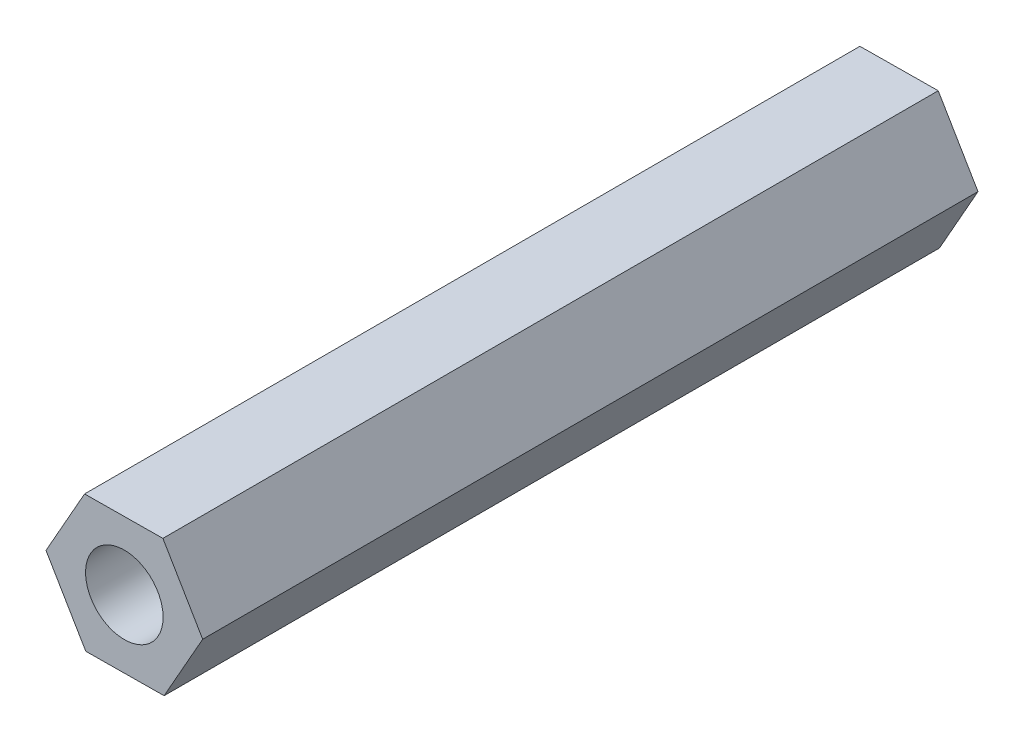
ISO-10303-21;
HEADER;
FILE_DESCRIPTION(('STEP AP214'),'2;1');
FILE_NAME('part.step','',(''),(''),'','','');
FILE_SCHEMA(('AUTOMOTIVE_DESIGN { 1 0 10303 214 1 1 1 1 }'));
ENDSEC;
DATA;
#1=APPLICATION_CONTEXT('core data for automotive mechanical design processes');
#2=APPLICATION_PROTOCOL_DEFINITION('international standard','automotive_design',2000,#1);
#3=PRODUCT_CONTEXT('',#1,'mechanical');
#4=PRODUCT('Part','Part','',(#3));
#5=PRODUCT_RELATED_PRODUCT_CATEGORY('part','',(#4));
#6=PRODUCT_DEFINITION_FORMATION('','',#4);
#7=PRODUCT_DEFINITION_CONTEXT('part definition',#1,'design');
#8=PRODUCT_DEFINITION('design','',#6,#7);
#9=PRODUCT_DEFINITION_SHAPE('','',#8);
#10=(LENGTH_UNIT() NAMED_UNIT(*) SI_UNIT(.MILLI.,.METRE.));
#11=(NAMED_UNIT(*) PLANE_ANGLE_UNIT() SI_UNIT($,.RADIAN.));
#12=(NAMED_UNIT(*) SI_UNIT($,.STERADIAN.) SOLID_ANGLE_UNIT());
#13=UNCERTAINTY_MEASURE_WITH_UNIT(LENGTH_MEASURE(1.E-05),#10,'distance_accuracy_value','');
#14=(GEOMETRIC_REPRESENTATION_CONTEXT(3) GLOBAL_UNCERTAINTY_ASSIGNED_CONTEXT((#13)) GLOBAL_UNIT_ASSIGNED_CONTEXT((#10,
#11,#12)) REPRESENTATION_CONTEXT('',''));
#15=CARTESIAN_POINT('',(0.,0.,0.));
#16=DIRECTION('',(0.,0.,1.));
#17=DIRECTION('',(1.,0.,0.));
#18=AXIS2_PLACEMENT_3D('',#15,#16,#17);
#19=CARTESIAN_POINT('',(0.,0.,40.));
#20=DIRECTION('',(0.,0.,1.));
#21=DIRECTION('',(1.,0.,0.));
#22=AXIS2_PLACEMENT_3D('',#19,#20,#21);
#23=PLANE('',#22);
#24=DIRECTION('',(0.999961257640527,0.00880245522430722,0.));
#25=VECTOR('',#24,1.);
#26=CARTESIAN_POINT('',(-1.98983906118775,-3.51765175136834,40.));
#27=LINE('',#26,#25);
#28=CARTESIAN_POINT('',(-1.98983906118775,-3.51765175136834,40.));
#29=VERTEX_POINT('',#28);
#30=CARTESIAN_POINT('',(2.05145624775792,-3.48207705211536,40.));
#31=VERTEX_POINT('',#30);
#32=EDGE_CURVE('E131',#29,#31,#27,.T.);
#33=ORIENTED_EDGE('',*,*,#32,.T.);
#34=DIRECTION('',(0.492357478980338,0.870393079529086,0.));
#35=VECTOR('',#34,1.);
#36=CARTESIAN_POINT('',(2.05145624775792,-3.48207705211536,40.));
#37=LINE('',#36,#35);
#38=CARTESIAN_POINT('',(4.04129530894568,0.0355746992529791,40.));
#39=VERTEX_POINT('',#38);
#40=EDGE_CURVE('E89',#31,#39,#37,.T.);
#41=ORIENTED_EDGE('',*,*,#40,.T.);
#42=DIRECTION('',(-0.507603778660189,0.861590624304779,0.));
#43=VECTOR('',#42,1.);
#44=CARTESIAN_POINT('',(4.04129530894568,0.0355746992529791,40.));
#45=LINE('',#44,#43);
#46=CARTESIAN_POINT('',(1.98983906118776,3.51765175136834,40.));
#47=VERTEX_POINT('',#46);
#48=EDGE_CURVE('E102',#39,#47,#45,.T.);
#49=ORIENTED_EDGE('',*,*,#48,.T.);
#50=DIRECTION('',(-0.999961257640527,-0.00880245522430723,0.));
#51=VECTOR('',#50,1.);
#52=CARTESIAN_POINT('',(1.98983906118776,3.51765175136834,40.));
#53=LINE('',#52,#51);
#54=CARTESIAN_POINT('',(-2.05145624775791,3.48207705211536,40.));
#55=VERTEX_POINT('',#54);
#56=EDGE_CURVE('E96',#47,#55,#53,.T.);
#57=ORIENTED_EDGE('',*,*,#56,.T.);
#58=DIRECTION('',(-0.492357478980338,-0.870393079529086,0.));
#59=VECTOR('',#58,1.);
#60=CARTESIAN_POINT('',(-2.05145624775791,3.48207705211536,40.));
#61=LINE('',#60,#59);
#62=CARTESIAN_POINT('',(-4.04129530894568,-0.0355746992529825,40.));
#63=VERTEX_POINT('',#62);
#64=EDGE_CURVE('E100',#55,#63,#61,.T.);
#65=ORIENTED_EDGE('',*,*,#64,.T.);
#66=DIRECTION('',(0.507603778660189,-0.861590624304779,0.));
#67=VECTOR('',#66,1.);
#68=CARTESIAN_POINT('',(-4.04129530894568,-0.0355746992529825,40.));
#69=LINE('',#68,#67);
#70=EDGE_CURVE('E52',#63,#29,#69,.T.);
#71=ORIENTED_EDGE('',*,*,#70,.T.);
#72=EDGE_LOOP('',(#33,#41,#49,#57,#65,#71));
#73=FACE_BOUND('',#72,.T.);
#74=CARTESIAN_POINT('',(0.,0.,40.));
#75=DIRECTION('',(0.,0.,1.));
#76=DIRECTION('',(1.,0.,0.));
#77=AXIS2_PLACEMENT_3D('',#74,#75,#76);
#78=CIRCLE('',#77,2.);
#79=CARTESIAN_POINT('',(2.,0.,40.));
#80=VERTEX_POINT('',#79);
#81=EDGE_CURVE('E124',#80,#80,#78,.T.);
#82=ORIENTED_EDGE('',*,*,#81,.F.);
#83=EDGE_LOOP('',(#82));
#84=FACE_BOUND('',#83,.T.);
#85=ADVANCED_FACE('F35',(#73,#84),#23,.T.);
#86=CARTESIAN_POINT('',(0.,0.,0.));
#87=DIRECTION('',(0.,0.,1.));
#88=DIRECTION('',(1.,0.,0.));
#89=AXIS2_PLACEMENT_3D('',#86,#87,#88);
#90=PLANE('',#89);
#91=DIRECTION('',(0.999961257640527,0.00880245522430722,0.));
#92=VECTOR('',#91,1.);
#93=CARTESIAN_POINT('',(-1.98983906118775,-3.51765175136834,0.));
#94=LINE('',#93,#92);
#95=CARTESIAN_POINT('',(-1.98983906118775,-3.51765175136834,0.));
#96=VERTEX_POINT('',#95);
#97=CARTESIAN_POINT('',(2.05145624775792,-3.48207705211536,0.));
#98=VERTEX_POINT('',#97);
#99=EDGE_CURVE('E120',#96,#98,#94,.T.);
#100=ORIENTED_EDGE('',*,*,#99,.F.);
#101=DIRECTION('',(0.507603778660189,-0.861590624304779,0.));
#102=VECTOR('',#101,1.);
#103=CARTESIAN_POINT('',(-4.04129530894568,-0.0355746992529825,0.));
#104=LINE('',#103,#102);
#105=CARTESIAN_POINT('',(-4.04129530894568,-0.0355746992529825,0.));
#106=VERTEX_POINT('',#105);
#107=EDGE_CURVE('E81',#106,#96,#104,.T.);
#108=ORIENTED_EDGE('',*,*,#107,.F.);
#109=DIRECTION('',(-0.492357478980338,-0.870393079529086,0.));
#110=VECTOR('',#109,1.);
#111=CARTESIAN_POINT('',(-2.05145624775791,3.48207705211536,0.));
#112=LINE('',#111,#110);
#113=CARTESIAN_POINT('',(-2.05145624775791,3.48207705211536,0.));
#114=VERTEX_POINT('',#113);
#115=EDGE_CURVE('E75',#114,#106,#112,.T.);
#116=ORIENTED_EDGE('',*,*,#115,.F.);
#117=DIRECTION('',(-0.999961257640527,-0.00880245522430723,0.));
#118=VECTOR('',#117,1.);
#119=CARTESIAN_POINT('',(1.98983906118776,3.51765175136834,0.));
#120=LINE('',#119,#118);
#121=CARTESIAN_POINT('',(1.98983906118776,3.51765175136834,0.));
#122=VERTEX_POINT('',#121);
#123=EDGE_CURVE('E110',#122,#114,#120,.T.);
#124=ORIENTED_EDGE('',*,*,#123,.F.);
#125=DIRECTION('',(-0.507603778660189,0.861590624304779,0.));
#126=VECTOR('',#125,1.);
#127=CARTESIAN_POINT('',(4.04129530894568,0.0355746992529791,0.));
#128=LINE('',#127,#126);
#129=CARTESIAN_POINT('',(4.04129530894568,0.0355746992529791,0.));
#130=VERTEX_POINT('',#129);
#131=EDGE_CURVE('E126',#130,#122,#128,.T.);
#132=ORIENTED_EDGE('',*,*,#131,.F.);
#133=DIRECTION('',(0.492357478980338,0.870393079529086,0.));
#134=VECTOR('',#133,1.);
#135=CARTESIAN_POINT('',(2.05145624775792,-3.48207705211536,0.));
#136=LINE('',#135,#134);
#137=EDGE_CURVE('E123',#98,#130,#136,.T.);
#138=ORIENTED_EDGE('',*,*,#137,.F.);
#139=EDGE_LOOP('',(#100,#108,#116,#124,#132,#138));
#140=FACE_BOUND('',#139,.T.);
#141=CARTESIAN_POINT('',(0.,0.,0.));
#142=DIRECTION('',(0.,0.,1.));
#143=DIRECTION('',(1.,0.,0.));
#144=AXIS2_PLACEMENT_3D('',#141,#142,#143);
#145=CIRCLE('',#144,2.);
#146=CARTESIAN_POINT('',(2.,0.,0.));
#147=VERTEX_POINT('',#146);
#148=EDGE_CURVE('E224',#147,#147,#145,.T.);
#149=ORIENTED_EDGE('',*,*,#148,.T.);
#150=EDGE_LOOP('',(#149));
#151=FACE_BOUND('',#150,.T.);
#152=ADVANCED_FACE('F140',(#140,#151),#90,.F.);
#153=CARTESIAN_POINT('',(-1.98983906118775,-3.51765175136834,40.));
#154=DIRECTION('',(-0.00880245522430722,0.999961257640527,0.));
#155=DIRECTION('',(-0.999961257640527,-0.00880245522430722,0.));
#156=AXIS2_PLACEMENT_3D('',#153,#154,#155);
#157=PLANE('',#156);
#158=ORIENTED_EDGE('',*,*,#99,.T.);
#159=DIRECTION('',(0.,0.,-1.));
#160=VECTOR('',#159,1.);
#161=CARTESIAN_POINT('',(2.05145624775792,-3.48207705211536,40.));
#162=LINE('',#161,#160);
#163=EDGE_CURVE('E11',#31,#98,#162,.T.);
#164=ORIENTED_EDGE('',*,*,#163,.F.);
#165=ORIENTED_EDGE('',*,*,#32,.F.);
#166=DIRECTION('',(0.,0.,-1.));
#167=VECTOR('',#166,1.);
#168=CARTESIAN_POINT('',(-1.98983906118775,-3.51765175136834,40.));
#169=LINE('',#168,#167);
#170=EDGE_CURVE('E116',#29,#96,#169,.T.);
#171=ORIENTED_EDGE('',*,*,#170,.T.);
#172=EDGE_LOOP('',(#158,#164,#165,#171));
#173=FACE_BOUND('',#172,.T.);
#174=ADVANCED_FACE('F37',(#173),#157,.F.);
#175=CARTESIAN_POINT('',(2.05145624775792,-3.48207705211536,40.));
#176=DIRECTION('',(-0.870393079529086,0.492357478980338,0.));
#177=DIRECTION('',(-0.492357478980338,-0.870393079529086,0.));
#178=AXIS2_PLACEMENT_3D('',#175,#176,#177);
#179=PLANE('',#178);
#180=ORIENTED_EDGE('',*,*,#137,.T.);
#181=DIRECTION('',(0.,0.,-1.));
#182=VECTOR('',#181,1.);
#183=CARTESIAN_POINT('',(4.04129530894568,0.0355746992529791,40.));
#184=LINE('',#183,#182);
#185=EDGE_CURVE('E44',#39,#130,#184,.T.);
#186=ORIENTED_EDGE('',*,*,#185,.F.);
#187=ORIENTED_EDGE('',*,*,#40,.F.);
#188=ORIENTED_EDGE('',*,*,#163,.T.);
#189=EDGE_LOOP('',(#180,#186,#187,#188));
#190=FACE_BOUND('',#189,.T.);
#191=ADVANCED_FACE('F165',(#190),#179,.F.);
#192=CARTESIAN_POINT('',(4.04129530894568,0.0355746992529791,40.));
#193=DIRECTION('',(-0.861590624304779,-0.507603778660189,0.));
#194=DIRECTION('',(0.507603778660189,-0.861590624304779,0.));
#195=AXIS2_PLACEMENT_3D('',#192,#193,#194);
#196=PLANE('',#195);
#197=ORIENTED_EDGE('',*,*,#131,.T.);
#198=DIRECTION('',(0.,0.,-1.));
#199=VECTOR('',#198,1.);
#200=CARTESIAN_POINT('',(1.98983906118776,3.51765175136834,40.));
#201=LINE('',#200,#199);
#202=EDGE_CURVE('E111',#47,#122,#201,.T.);
#203=ORIENTED_EDGE('',*,*,#202,.F.);
#204=ORIENTED_EDGE('',*,*,#48,.F.);
#205=ORIENTED_EDGE('',*,*,#185,.T.);
#206=EDGE_LOOP('',(#197,#203,#204,#205));
#207=FACE_BOUND('',#206,.T.);
#208=ADVANCED_FACE('F137',(#207),#196,.F.);
#209=CARTESIAN_POINT('',(1.98983906118776,3.51765175136834,40.));
#210=DIRECTION('',(0.00880245522430723,-0.999961257640527,0.));
#211=DIRECTION('',(0.999961257640527,0.00880245522430723,0.));
#212=AXIS2_PLACEMENT_3D('',#209,#210,#211);
#213=PLANE('',#212);
#214=ORIENTED_EDGE('',*,*,#123,.T.);
#215=DIRECTION('',(0.,0.,-1.));
#216=VECTOR('',#215,1.);
#217=CARTESIAN_POINT('',(-2.05145624775791,3.48207705211536,40.));
#218=LINE('',#217,#216);
#219=EDGE_CURVE('E107',#55,#114,#218,.T.);
#220=ORIENTED_EDGE('',*,*,#219,.F.);
#221=ORIENTED_EDGE('',*,*,#56,.F.);
#222=ORIENTED_EDGE('',*,*,#202,.T.);
#223=EDGE_LOOP('',(#214,#220,#221,#222));
#224=FACE_BOUND('',#223,.T.);
#225=ADVANCED_FACE('F108',(#224),#213,.F.);
#226=CARTESIAN_POINT('',(-2.05145624775791,3.48207705211536,40.));
#227=DIRECTION('',(0.870393079529086,-0.492357478980338,0.));
#228=DIRECTION('',(0.492357478980338,0.870393079529086,0.));
#229=AXIS2_PLACEMENT_3D('',#226,#227,#228);
#230=PLANE('',#229);
#231=ORIENTED_EDGE('',*,*,#115,.T.);
#232=DIRECTION('',(0.,0.,-1.));
#233=VECTOR('',#232,1.);
#234=CARTESIAN_POINT('',(-4.04129530894568,-0.0355746992529825,40.));
#235=LINE('',#234,#233);
#236=EDGE_CURVE('E112',#63,#106,#235,.T.);
#237=ORIENTED_EDGE('',*,*,#236,.F.);
#238=ORIENTED_EDGE('',*,*,#64,.F.);
#239=ORIENTED_EDGE('',*,*,#219,.T.);
#240=EDGE_LOOP('',(#231,#237,#238,#239));
#241=FACE_BOUND('',#240,.T.);
#242=ADVANCED_FACE('F114',(#241),#230,.F.);
#243=CARTESIAN_POINT('',(-4.04129530894568,-0.0355746992529825,40.));
#244=DIRECTION('',(0.861590624304779,0.507603778660189,0.));
#245=DIRECTION('',(-0.507603778660189,0.861590624304779,0.));
#246=AXIS2_PLACEMENT_3D('',#243,#244,#245);
#247=PLANE('',#246);
#248=ORIENTED_EDGE('',*,*,#107,.T.);
#249=ORIENTED_EDGE('',*,*,#170,.F.);
#250=ORIENTED_EDGE('',*,*,#70,.F.);
#251=ORIENTED_EDGE('',*,*,#236,.T.);
#252=EDGE_LOOP('',(#248,#249,#250,#251));
#253=FACE_BOUND('',#252,.T.);
#254=ADVANCED_FACE('F145',(#253),#247,.F.);
#255=CARTESIAN_POINT('',(0.,0.,40.));
#256=DIRECTION('',(0.,0.,-1.));
#257=DIRECTION('',(-1.,0.,0.));
#258=AXIS2_PLACEMENT_3D('',#255,#256,#257);
#259=CYLINDRICAL_SURFACE('',#258,2.);
#260=ORIENTED_EDGE('',*,*,#81,.T.);
#261=EDGE_LOOP('',(#260));
#262=FACE_BOUND('',#261,.T.);
#263=ORIENTED_EDGE('',*,*,#148,.F.);
#264=EDGE_LOOP('',(#263));
#265=FACE_BOUND('',#264,.T.);
#266=ADVANCED_FACE('F147',(#262,#265),#259,.F.);
#267=CLOSED_SHELL('',(#85,#152,#174,#191,#208,#225,#242,#254,#266));
#268=MANIFOLD_SOLID_BREP('B2',#267);
#269=ADVANCED_BREP_SHAPE_REPRESENTATION('',(#18,#268),#14);
#270=SHAPE_DEFINITION_REPRESENTATION(#9,#269);
ENDSEC;
END-ISO-10303-21;
